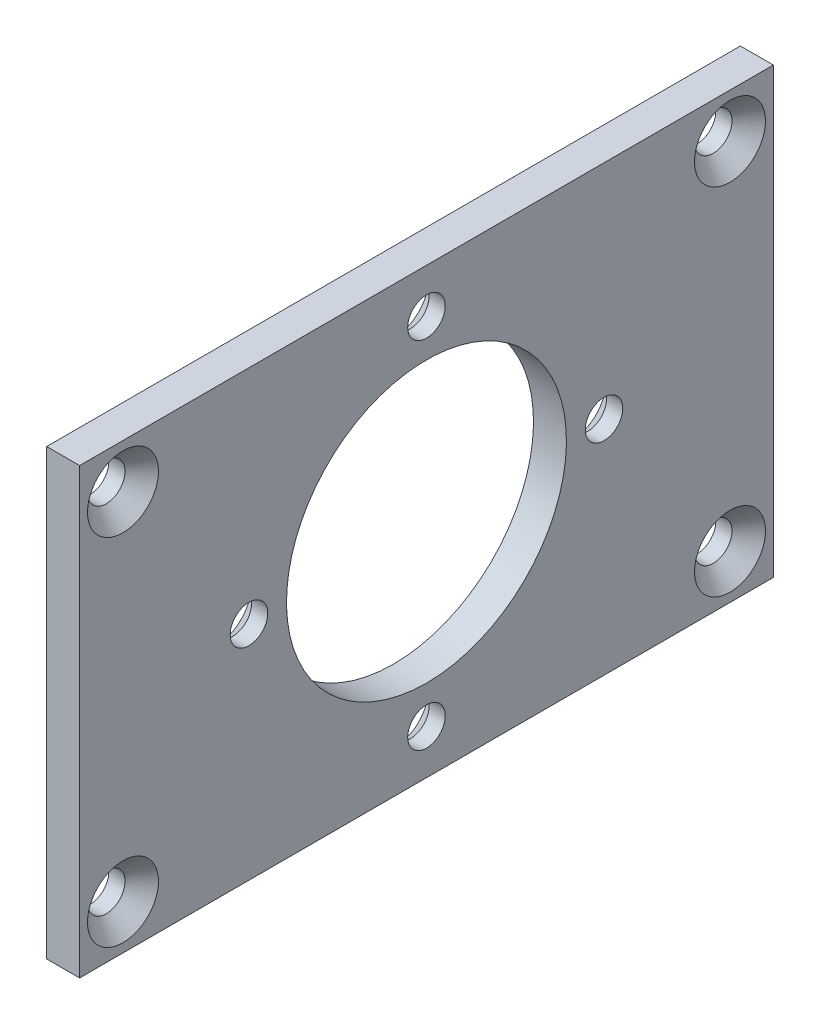
ISO-10303-21;
HEADER;
FILE_DESCRIPTION(('STEP AP214'),'2;1');
FILE_NAME('part.step','',(''),(''),'','','');
FILE_SCHEMA(('AUTOMOTIVE_DESIGN { 1 0 10303 214 1 1 1 1 }'));
ENDSEC;
DATA;
#1=APPLICATION_CONTEXT('core data for automotive mechanical design processes');
#2=APPLICATION_PROTOCOL_DEFINITION('international standard','automotive_design',2000,#1);
#3=PRODUCT_CONTEXT('',#1,'mechanical');
#4=PRODUCT('Part','Part','',(#3));
#5=PRODUCT_RELATED_PRODUCT_CATEGORY('part','',(#4));
#6=PRODUCT_DEFINITION_FORMATION('','',#4);
#7=PRODUCT_DEFINITION_CONTEXT('part definition',#1,'design');
#8=PRODUCT_DEFINITION('design','',#6,#7);
#9=PRODUCT_DEFINITION_SHAPE('','',#8);
#10=(LENGTH_UNIT() NAMED_UNIT(*) SI_UNIT(.MILLI.,.METRE.));
#11=(NAMED_UNIT(*) PLANE_ANGLE_UNIT() SI_UNIT($,.RADIAN.));
#12=(NAMED_UNIT(*) SI_UNIT($,.STERADIAN.) SOLID_ANGLE_UNIT());
#13=UNCERTAINTY_MEASURE_WITH_UNIT(LENGTH_MEASURE(1.E-05),#10,'distance_accuracy_value','');
#14=(GEOMETRIC_REPRESENTATION_CONTEXT(3) GLOBAL_UNCERTAINTY_ASSIGNED_CONTEXT((#13)) GLOBAL_UNIT_ASSIGNED_CONTEXT((#10,
#11,#12)) REPRESENTATION_CONTEXT('',''));
#15=CARTESIAN_POINT('',(0.,0.,0.));
#16=DIRECTION('',(0.,0.,1.));
#17=DIRECTION('',(1.,0.,0.));
#18=AXIS2_PLACEMENT_3D('',#15,#16,#17);
#19=CARTESIAN_POINT('',(0.,-8.14199792141975,-17.8977220287288));
#20=DIRECTION('',(1.,0.,0.));
#21=DIRECTION('',(0.,1.,0.));
#22=AXIS2_PLACEMENT_3D('',#19,#20,#21);
#23=PLANE('',#22);
#24=CARTESIAN_POINT('',(0.,-8.14199792141975,-17.8977220287288));
#25=DIRECTION('',(1.,0.,0.));
#26=DIRECTION('',(0.,1.,0.));
#27=AXIS2_PLACEMENT_3D('',#24,#25,#26);
#28=CIRCLE('',#27,20.5);
#29=CARTESIAN_POINT('',(0.,-28.6419979214198,-17.8977220287288));
#30=VERTEX_POINT('',#29);
#31=EDGE_CURVE('E169',#30,#30,#28,.T.);
#32=ORIENTED_EDGE('',*,*,#31,.T.);
#33=EDGE_LOOP('',(#32));
#34=FACE_BOUND('',#33,.T.);
#35=CARTESIAN_POINT('',(0.,17.8580020785802,-17.8977220287288));
#36=DIRECTION('',(1.,0.,0.));
#37=DIRECTION('',(0.,-1.,0.));
#38=AXIS2_PLACEMENT_3D('',#35,#36,#37);
#39=CIRCLE('',#38,5.2);
#40=CARTESIAN_POINT('',(0.,23.0580020785802,-17.8977220287288));
#41=VERTEX_POINT('',#40);
#42=EDGE_CURVE('E304',#41,#41,#39,.T.);
#43=ORIENTED_EDGE('',*,*,#42,.T.);
#44=EDGE_LOOP('',(#43));
#45=FACE_BOUND('',#44,.T.);
#46=CARTESIAN_POINT('',(0.,-8.14199792141975,-43.8977220287288));
#47=DIRECTION('',(1.,0.,0.));
#48=DIRECTION('',(0.,0.,1.));
#49=AXIS2_PLACEMENT_3D('',#46,#47,#48);
#50=CIRCLE('',#49,5.2);
#51=CARTESIAN_POINT('',(0.,-8.14199792141975,-49.0977220287288));
#52=VERTEX_POINT('',#51);
#53=EDGE_CURVE('E165',#52,#52,#50,.T.);
#54=ORIENTED_EDGE('',*,*,#53,.T.);
#55=EDGE_LOOP('',(#54));
#56=FACE_BOUND('',#55,.T.);
#57=CARTESIAN_POINT('',(0.,-34.1419979214198,-17.8977220287288));
#58=DIRECTION('',(1.,0.,0.));
#59=DIRECTION('',(0.,1.,0.));
#60=AXIS2_PLACEMENT_3D('',#57,#58,#59);
#61=CIRCLE('',#60,5.2);
#62=CARTESIAN_POINT('',(0.,-39.3419979214198,-17.8977220287288));
#63=VERTEX_POINT('',#62);
#64=EDGE_CURVE('E218',#63,#63,#61,.T.);
#65=ORIENTED_EDGE('',*,*,#64,.T.);
#66=EDGE_LOOP('',(#65));
#67=FACE_BOUND('',#66,.T.);
#68=CARTESIAN_POINT('',(0.,-8.14199792141976,8.10227797127123));
#69=DIRECTION('',(1.,0.,0.));
#70=DIRECTION('',(0.,0.,-1.));
#71=AXIS2_PLACEMENT_3D('',#68,#69,#70);
#72=CIRCLE('',#71,5.2);
#73=CARTESIAN_POINT('',(0.,-8.14199792141976,13.3022779712712));
#74=VERTEX_POINT('',#73);
#75=EDGE_CURVE('E189',#74,#74,#72,.T.);
#76=ORIENTED_EDGE('',*,*,#75,.T.);
#77=EDGE_LOOP('',(#76));
#78=FACE_BOUND('',#77,.T.);
#79=CARTESIAN_POINT('',(0.,17.8580020785802,26.5522779712712));
#80=DIRECTION('',(1.,0.,0.));
#81=DIRECTION('',(0.,1.,0.));
#82=AXIS2_PLACEMENT_3D('',#79,#80,#81);
#83=CIRCLE('',#82,2.75);
#84=CARTESIAN_POINT('',(0.,15.1080020785802,26.5522779712712));
#85=VERTEX_POINT('',#84);
#86=EDGE_CURVE('E179',#85,#85,#83,.T.);
#87=ORIENTED_EDGE('',*,*,#86,.T.);
#88=EDGE_LOOP('',(#87));
#89=FACE_BOUND('',#88,.T.);
#90=CARTESIAN_POINT('',(0.,17.8580020785802,-62.3477220287288));
#91=DIRECTION('',(1.,0.,0.));
#92=DIRECTION('',(0.,1.,0.));
#93=AXIS2_PLACEMENT_3D('',#90,#91,#92);
#94=CIRCLE('',#93,2.75);
#95=CARTESIAN_POINT('',(0.,15.1080020785802,-62.3477220287288));
#96=VERTEX_POINT('',#95);
#97=EDGE_CURVE('E204',#96,#96,#94,.T.);
#98=ORIENTED_EDGE('',*,*,#97,.T.);
#99=EDGE_LOOP('',(#98));
#100=FACE_BOUND('',#99,.T.);
#101=CARTESIAN_POINT('',(0.,-34.1419979214198,26.5522779712712));
#102=DIRECTION('',(1.,0.,0.));
#103=DIRECTION('',(0.,1.,0.));
#104=AXIS2_PLACEMENT_3D('',#101,#102,#103);
#105=CIRCLE('',#104,2.75);
#106=CARTESIAN_POINT('',(0.,-36.8919979214198,26.5522779712712));
#107=VERTEX_POINT('',#106);
#108=EDGE_CURVE('E185',#107,#107,#105,.T.);
#109=ORIENTED_EDGE('',*,*,#108,.T.);
#110=EDGE_LOOP('',(#109));
#111=FACE_BOUND('',#110,.T.);
#112=CARTESIAN_POINT('',(0.,-34.1419979214198,-62.3477220287288));
#113=DIRECTION('',(1.,0.,0.));
#114=DIRECTION('',(0.,1.,0.));
#115=AXIS2_PLACEMENT_3D('',#112,#113,#114);
#116=CIRCLE('',#115,2.75);
#117=CARTESIAN_POINT('',(0.,-36.8919979214198,-62.3477220287288));
#118=VERTEX_POINT('',#117);
#119=EDGE_CURVE('E274',#118,#118,#116,.T.);
#120=ORIENTED_EDGE('',*,*,#119,.T.);
#121=EDGE_LOOP('',(#120));
#122=FACE_BOUND('',#121,.T.);
#123=DIRECTION('',(0.,0.,1.));
#124=VECTOR('',#123,1.);
#125=CARTESIAN_POINT('',(0.,-40.6419979214198,-68.6977220287288));
#126=LINE('',#125,#124);
#127=CARTESIAN_POINT('',(0.,-40.6419979214198,-68.6977220287288));
#128=VERTEX_POINT('',#127);
#129=CARTESIAN_POINT('',(0.,-40.6419979214198,32.9022779712712));
#130=VERTEX_POINT('',#129);
#131=EDGE_CURVE('E26',#128,#130,#126,.T.);
#132=ORIENTED_EDGE('',*,*,#131,.T.);
#133=DIRECTION('',(0.,1.,0.));
#134=VECTOR('',#133,1.);
#135=CARTESIAN_POINT('',(0.,-40.6419979214198,32.9022779712712));
#136=LINE('',#135,#134);
#137=CARTESIAN_POINT('',(0.,24.3580020785802,32.9022779712712));
#138=VERTEX_POINT('',#137);
#139=EDGE_CURVE('E248',#130,#138,#136,.T.);
#140=ORIENTED_EDGE('',*,*,#139,.T.);
#141=DIRECTION('',(0.,0.,-1.));
#142=VECTOR('',#141,1.);
#143=CARTESIAN_POINT('',(0.,24.3580020785802,32.9022779712712));
#144=LINE('',#143,#142);
#145=CARTESIAN_POINT('',(0.,24.3580020785802,-68.6977220287288));
#146=VERTEX_POINT('',#145);
#147=EDGE_CURVE('E224',#138,#146,#144,.T.);
#148=ORIENTED_EDGE('',*,*,#147,.T.);
#149=DIRECTION('',(0.,-1.,0.));
#150=VECTOR('',#149,1.);
#151=CARTESIAN_POINT('',(0.,24.3580020785802,-68.6977220287288));
#152=LINE('',#151,#150);
#153=EDGE_CURVE('E235',#146,#128,#152,.T.);
#154=ORIENTED_EDGE('',*,*,#153,.T.);
#155=EDGE_LOOP('',(#132,#140,#148,#154));
#156=FACE_BOUND('',#155,.T.);
#157=ADVANCED_FACE('F16',(#34,#45,#56,#67,#78,#89,#100,#111,#122,#156),#23,.F.);
#158=CARTESIAN_POINT('',(4.826,-8.14199792141975,-17.8977220287288));
#159=DIRECTION('',(1.,0.,0.));
#160=DIRECTION('',(0.,1.,0.));
#161=AXIS2_PLACEMENT_3D('',#158,#159,#160);
#162=PLANE('',#161);
#163=CARTESIAN_POINT('',(4.826,-8.14199792141975,-17.8977220287288));
#164=DIRECTION('',(-1.,0.,0.));
#165=DIRECTION('',(0.,1.,0.));
#166=AXIS2_PLACEMENT_3D('',#163,#164,#165);
#167=CIRCLE('',#166,20.5);
#168=CARTESIAN_POINT('',(4.826,-28.6419979214198,-17.8977220287288));
#169=VERTEX_POINT('',#168);
#170=EDGE_CURVE('E173',#169,#169,#167,.T.);
#171=ORIENTED_EDGE('',*,*,#170,.T.);
#172=EDGE_LOOP('',(#171));
#173=FACE_BOUND('',#172,.T.);
#174=CARTESIAN_POINT('',(4.826,17.8580020785802,-17.8977220287288));
#175=DIRECTION('',(-1.,0.,0.));
#176=DIRECTION('',(0.,-1.,0.));
#177=AXIS2_PLACEMENT_3D('',#174,#175,#176);
#178=CIRCLE('',#177,2.75);
#179=CARTESIAN_POINT('',(4.826,20.6080020785802,-17.8977220287288));
#180=VERTEX_POINT('',#179);
#181=EDGE_CURVE('E171',#180,#180,#178,.T.);
#182=ORIENTED_EDGE('',*,*,#181,.T.);
#183=EDGE_LOOP('',(#182));
#184=FACE_BOUND('',#183,.T.);
#185=CARTESIAN_POINT('',(4.826,-8.14199792141975,-43.8977220287288));
#186=DIRECTION('',(-1.,0.,0.));
#187=DIRECTION('',(0.,0.,1.));
#188=AXIS2_PLACEMENT_3D('',#185,#186,#187);
#189=CIRCLE('',#188,2.75);
#190=CARTESIAN_POINT('',(4.826,-8.14199792141975,-46.6477220287288));
#191=VERTEX_POINT('',#190);
#192=EDGE_CURVE('E151',#191,#191,#189,.T.);
#193=ORIENTED_EDGE('',*,*,#192,.T.);
#194=EDGE_LOOP('',(#193));
#195=FACE_BOUND('',#194,.T.);
#196=CARTESIAN_POINT('',(4.826,-34.1419979214198,-17.8977220287288));
#197=DIRECTION('',(-1.,0.,0.));
#198=DIRECTION('',(0.,1.,0.));
#199=AXIS2_PLACEMENT_3D('',#196,#197,#198);
#200=CIRCLE('',#199,2.75);
#201=CARTESIAN_POINT('',(4.826,-36.8919979214198,-17.8977220287288));
#202=VERTEX_POINT('',#201);
#203=EDGE_CURVE('E231',#202,#202,#200,.T.);
#204=ORIENTED_EDGE('',*,*,#203,.T.);
#205=EDGE_LOOP('',(#204));
#206=FACE_BOUND('',#205,.T.);
#207=CARTESIAN_POINT('',(4.826,-8.14199792141976,8.10227797127123));
#208=DIRECTION('',(-1.,0.,0.));
#209=DIRECTION('',(0.,0.,-1.));
#210=AXIS2_PLACEMENT_3D('',#207,#208,#209);
#211=CIRCLE('',#210,2.75);
#212=CARTESIAN_POINT('',(4.826,-8.14199792141976,10.8522779712712));
#213=VERTEX_POINT('',#212);
#214=EDGE_CURVE('E256',#213,#213,#211,.T.);
#215=ORIENTED_EDGE('',*,*,#214,.T.);
#216=EDGE_LOOP('',(#215));
#217=FACE_BOUND('',#216,.T.);
#218=CARTESIAN_POINT('',(4.826,17.8580020785802,26.5522779712712));
#219=DIRECTION('',(-1.,0.,0.));
#220=DIRECTION('',(0.,1.,0.));
#221=AXIS2_PLACEMENT_3D('',#218,#219,#220);
#222=CIRCLE('',#221,5.2);
#223=CARTESIAN_POINT('',(4.826,12.6580020785802,26.5522779712712));
#224=VERTEX_POINT('',#223);
#225=EDGE_CURVE('E208',#224,#224,#222,.T.);
#226=ORIENTED_EDGE('',*,*,#225,.T.);
#227=EDGE_LOOP('',(#226));
#228=FACE_BOUND('',#227,.T.);
#229=CARTESIAN_POINT('',(4.826,17.8580020785802,-62.3477220287288));
#230=DIRECTION('',(-1.,0.,0.));
#231=DIRECTION('',(0.,1.,0.));
#232=AXIS2_PLACEMENT_3D('',#229,#230,#231);
#233=CIRCLE('',#232,5.2);
#234=CARTESIAN_POINT('',(4.826,12.6580020785802,-62.3477220287288));
#235=VERTEX_POINT('',#234);
#236=EDGE_CURVE('E227',#235,#235,#233,.T.);
#237=ORIENTED_EDGE('',*,*,#236,.T.);
#238=EDGE_LOOP('',(#237));
#239=FACE_BOUND('',#238,.T.);
#240=CARTESIAN_POINT('',(4.826,-34.1419979214198,26.5522779712712));
#241=DIRECTION('',(-1.,0.,0.));
#242=DIRECTION('',(0.,1.,0.));
#243=AXIS2_PLACEMENT_3D('',#240,#241,#242);
#244=CIRCLE('',#243,5.2);
#245=CARTESIAN_POINT('',(4.826,-39.3419979214198,26.5522779712712));
#246=VERTEX_POINT('',#245);
#247=EDGE_CURVE('E266',#246,#246,#244,.T.);
#248=ORIENTED_EDGE('',*,*,#247,.T.);
#249=EDGE_LOOP('',(#248));
#250=FACE_BOUND('',#249,.T.);
#251=CARTESIAN_POINT('',(4.826,-34.1419979214198,-62.3477220287288));
#252=DIRECTION('',(-1.,0.,0.));
#253=DIRECTION('',(0.,1.,0.));
#254=AXIS2_PLACEMENT_3D('',#251,#252,#253);
#255=CIRCLE('',#254,5.2);
#256=CARTESIAN_POINT('',(4.826,-39.3419979214198,-62.3477220287288));
#257=VERTEX_POINT('',#256);
#258=EDGE_CURVE('E294',#257,#257,#255,.T.);
#259=ORIENTED_EDGE('',*,*,#258,.T.);
#260=EDGE_LOOP('',(#259));
#261=FACE_BOUND('',#260,.T.);
#262=DIRECTION('',(0.,0.,-1.));
#263=VECTOR('',#262,1.);
#264=CARTESIAN_POINT('',(4.826,-40.6419979214198,-68.6977220287288));
#265=LINE('',#264,#263);
#266=CARTESIAN_POINT('',(4.826,-40.6419979214198,32.9022779712712));
#267=VERTEX_POINT('',#266);
#268=CARTESIAN_POINT('',(4.826,-40.6419979214198,-68.6977220287288));
#269=VERTEX_POINT('',#268);
#270=EDGE_CURVE('E11',#267,#269,#265,.T.);
#271=ORIENTED_EDGE('',*,*,#270,.T.);
#272=DIRECTION('',(0.,1.,0.));
#273=VECTOR('',#272,1.);
#274=CARTESIAN_POINT('',(4.826,24.3580020785802,-68.6977220287288));
#275=LINE('',#274,#273);
#276=CARTESIAN_POINT('',(4.826,24.3580020785802,-68.6977220287288));
#277=VERTEX_POINT('',#276);
#278=EDGE_CURVE('E239',#269,#277,#275,.T.);
#279=ORIENTED_EDGE('',*,*,#278,.T.);
#280=DIRECTION('',(0.,0.,1.));
#281=VECTOR('',#280,1.);
#282=CARTESIAN_POINT('',(4.826,24.3580020785802,32.9022779712712));
#283=LINE('',#282,#281);
#284=CARTESIAN_POINT('',(4.826,24.3580020785802,32.9022779712712));
#285=VERTEX_POINT('',#284);
#286=EDGE_CURVE('E219',#277,#285,#283,.T.);
#287=ORIENTED_EDGE('',*,*,#286,.T.);
#288=DIRECTION('',(0.,-1.,0.));
#289=VECTOR('',#288,1.);
#290=CARTESIAN_POINT('',(4.826,-40.6419979214198,32.9022779712712));
#291=LINE('',#290,#289);
#292=EDGE_CURVE('E247',#285,#267,#291,.T.);
#293=ORIENTED_EDGE('',*,*,#292,.T.);
#294=EDGE_LOOP('',(#271,#279,#287,#293));
#295=FACE_BOUND('',#294,.T.);
#296=ADVANCED_FACE('F334',(#173,#184,#195,#206,#217,#228,#239,#250,#261,#295),#162,.T.);
#297=CARTESIAN_POINT('',(0.,-40.6419979214198,32.9022779712712));
#298=DIRECTION('',(0.,-1.,0.));
#299=DIRECTION('',(0.,0.,-1.));
#300=AXIS2_PLACEMENT_3D('',#297,#298,#299);
#301=PLANE('',#300);
#302=ORIENTED_EDGE('',*,*,#131,.F.);
#303=DIRECTION('',(1.,0.,0.));
#304=VECTOR('',#303,1.);
#305=CARTESIAN_POINT('',(0.,-40.6419979214198,-68.6977220287288));
#306=LINE('',#305,#304);
#307=EDGE_CURVE('E19',#128,#269,#306,.T.);
#308=ORIENTED_EDGE('',*,*,#307,.T.);
#309=ORIENTED_EDGE('',*,*,#270,.F.);
#310=DIRECTION('',(1.,0.,0.));
#311=VECTOR('',#310,1.);
#312=CARTESIAN_POINT('',(0.,-40.6419979214198,32.9022779712712));
#313=LINE('',#312,#311);
#314=EDGE_CURVE('E243',#130,#267,#313,.T.);
#315=ORIENTED_EDGE('',*,*,#314,.F.);
#316=EDGE_LOOP('',(#302,#308,#309,#315));
#317=FACE_BOUND('',#316,.T.);
#318=ADVANCED_FACE('F337',(#317),#301,.T.);
#319=CARTESIAN_POINT('',(0.,-40.6419979214198,-68.6977220287288));
#320=DIRECTION('',(0.,0.,-1.));
#321=DIRECTION('',(0.,-1.,0.));
#322=AXIS2_PLACEMENT_3D('',#319,#320,#321);
#323=PLANE('',#322);
#324=ORIENTED_EDGE('',*,*,#153,.F.);
#325=DIRECTION('',(1.,0.,0.));
#326=VECTOR('',#325,1.);
#327=CARTESIAN_POINT('',(0.,24.3580020785802,-68.6977220287288));
#328=LINE('',#327,#326);
#329=EDGE_CURVE('E223',#146,#277,#328,.T.);
#330=ORIENTED_EDGE('',*,*,#329,.T.);
#331=ORIENTED_EDGE('',*,*,#278,.F.);
#332=ORIENTED_EDGE('',*,*,#307,.F.);
#333=EDGE_LOOP('',(#324,#330,#331,#332));
#334=FACE_BOUND('',#333,.T.);
#335=ADVANCED_FACE('F406',(#334),#323,.T.);
#336=CARTESIAN_POINT('',(0.,24.3580020785802,-68.6977220287288));
#337=DIRECTION('',(0.,1.,0.));
#338=DIRECTION('',(1.,0.,0.));
#339=AXIS2_PLACEMENT_3D('',#336,#337,#338);
#340=PLANE('',#339);
#341=ORIENTED_EDGE('',*,*,#147,.F.);
#342=DIRECTION('',(1.,0.,0.));
#343=VECTOR('',#342,1.);
#344=CARTESIAN_POINT('',(0.,24.3580020785802,32.9022779712712));
#345=LINE('',#344,#343);
#346=EDGE_CURVE('E318',#138,#285,#345,.T.);
#347=ORIENTED_EDGE('',*,*,#346,.T.);
#348=ORIENTED_EDGE('',*,*,#286,.F.);
#349=ORIENTED_EDGE('',*,*,#329,.F.);
#350=EDGE_LOOP('',(#341,#347,#348,#349));
#351=FACE_BOUND('',#350,.T.);
#352=ADVANCED_FACE('F402',(#351),#340,.T.);
#353=CARTESIAN_POINT('',(0.,24.3580020785802,32.9022779712712));
#354=DIRECTION('',(0.,0.,1.));
#355=DIRECTION('',(1.,0.,0.));
#356=AXIS2_PLACEMENT_3D('',#353,#354,#355);
#357=PLANE('',#356);
#358=ORIENTED_EDGE('',*,*,#139,.F.);
#359=ORIENTED_EDGE('',*,*,#314,.T.);
#360=ORIENTED_EDGE('',*,*,#292,.F.);
#361=ORIENTED_EDGE('',*,*,#346,.F.);
#362=EDGE_LOOP('',(#358,#359,#360,#361));
#363=FACE_BOUND('',#362,.T.);
#364=ADVANCED_FACE('F391',(#363),#357,.T.);
#365=CARTESIAN_POINT('',(2.1717,-8.14199792141975,-17.8977220287288));
#366=DIRECTION('',(-1.,0.,0.));
#367=DIRECTION('',(0.,1.,0.));
#368=AXIS2_PLACEMENT_3D('',#365,#366,#367);
#369=CYLINDRICAL_SURFACE('',#368,20.5);
#370=ORIENTED_EDGE('',*,*,#170,.F.);
#371=DIRECTION('',(-1.,0.,0.));
#372=VECTOR('',#371,1.);
#373=CARTESIAN_POINT('',(2.1717,-28.6419979214198,-17.8977220287288));
#374=LINE('',#373,#372);
#375=EDGE_CURVE('E194',#169,#30,#374,.T.);
#376=ORIENTED_EDGE('',*,*,#375,.T.);
#377=ORIENTED_EDGE('',*,*,#31,.F.);
#378=ORIENTED_EDGE('',*,*,#375,.F.);
#379=EDGE_LOOP('',(#370,#376,#377,#378));
#380=FACE_BOUND('',#379,.T.);
#381=ADVANCED_FACE('F466',(#380),#369,.F.);
#382=CARTESIAN_POINT('',(2.6543,17.8580020785802,-17.8977220287288));
#383=DIRECTION('',(1.,0.,0.));
#384=DIRECTION('',(0.,-1.,0.));
#385=AXIS2_PLACEMENT_3D('',#382,#383,#384);
#386=CYLINDRICAL_SURFACE('',#385,2.75);
#387=CARTESIAN_POINT('',(2.45,17.8580020785802,-17.8977220287288));
#388=DIRECTION('',(1.,0.,0.));
#389=DIRECTION('',(0.,-1.,0.));
#390=AXIS2_PLACEMENT_3D('',#387,#388,#389);
#391=CIRCLE('',#390,2.75);
#392=CARTESIAN_POINT('',(2.45,20.6080020785802,-17.8977220287288));
#393=VERTEX_POINT('',#392);
#394=EDGE_CURVE('E249',#393,#393,#391,.T.);
#395=ORIENTED_EDGE('',*,*,#394,.F.);
#396=DIRECTION('',(1.,0.,0.));
#397=VECTOR('',#396,1.);
#398=CARTESIAN_POINT('',(2.6543,20.6080020785802,-17.8977220287288));
#399=LINE('',#398,#397);
#400=EDGE_CURVE('E174',#393,#180,#399,.T.);
#401=ORIENTED_EDGE('',*,*,#400,.T.);
#402=ORIENTED_EDGE('',*,*,#181,.F.);
#403=ORIENTED_EDGE('',*,*,#400,.F.);
#404=EDGE_LOOP('',(#395,#401,#402,#403));
#405=FACE_BOUND('',#404,.T.);
#406=ADVANCED_FACE('F472',(#405),#386,.F.);
#407=CARTESIAN_POINT('',(1.225,17.8580020785802,-17.8977220287288));
#408=DIRECTION('',(-1.,0.,0.));
#409=DIRECTION('',(0.,-1.,0.));
#410=AXIS2_PLACEMENT_3D('',#407,#408,#409);
#411=CONICAL_SURFACE('',#410,3.975,0.785398163397448);
#412=ORIENTED_EDGE('',*,*,#42,.F.);
#413=DIRECTION('',(0.707106781186548,-0.707106781186548,0.));
#414=VECTOR('',#413,1.);
#415=CARTESIAN_POINT('',(1.225,21.8330020785802,-17.8977220287288));
#416=LINE('',#415,#414);
#417=EDGE_CURVE('E253',#41,#393,#416,.T.);
#418=ORIENTED_EDGE('',*,*,#417,.T.);
#419=ORIENTED_EDGE('',*,*,#394,.T.);
#420=ORIENTED_EDGE('',*,*,#417,.F.);
#421=EDGE_LOOP('',(#412,#418,#419,#420));
#422=FACE_BOUND('',#421,.T.);
#423=ADVANCED_FACE('F463',(#422),#411,.F.);
#424=CARTESIAN_POINT('',(2.6543,-8.14199792141975,-43.8977220287288));
#425=DIRECTION('',(1.,0.,0.));
#426=DIRECTION('',(0.,0.,1.));
#427=AXIS2_PLACEMENT_3D('',#424,#425,#426);
#428=CYLINDRICAL_SURFACE('',#427,2.75);
#429=CARTESIAN_POINT('',(2.45,-8.14199792141975,-43.8977220287288));
#430=DIRECTION('',(1.,0.,0.));
#431=DIRECTION('',(0.,0.,1.));
#432=AXIS2_PLACEMENT_3D('',#429,#430,#431);
#433=CIRCLE('',#432,2.75);
#434=CARTESIAN_POINT('',(2.45,-8.14199792141975,-46.6477220287288));
#435=VERTEX_POINT('',#434);
#436=EDGE_CURVE('E149',#435,#435,#433,.T.);
#437=ORIENTED_EDGE('',*,*,#436,.F.);
#438=DIRECTION('',(1.,0.,0.));
#439=VECTOR('',#438,1.);
#440=CARTESIAN_POINT('',(2.6543,-8.14199792141975,-46.6477220287288));
#441=LINE('',#440,#439);
#442=EDGE_CURVE('E146',#435,#191,#441,.T.);
#443=ORIENTED_EDGE('',*,*,#442,.T.);
#444=ORIENTED_EDGE('',*,*,#192,.F.);
#445=ORIENTED_EDGE('',*,*,#442,.F.);
#446=EDGE_LOOP('',(#437,#443,#444,#445));
#447=FACE_BOUND('',#446,.T.);
#448=ADVANCED_FACE('F148',(#447),#428,.F.);
#449=CARTESIAN_POINT('',(1.225,-8.14199792141975,-43.8977220287288));
#450=DIRECTION('',(-1.,0.,0.));
#451=DIRECTION('',(0.,0.,1.));
#452=AXIS2_PLACEMENT_3D('',#449,#450,#451);
#453=CONICAL_SURFACE('',#452,3.975,0.785398163397448);
#454=ORIENTED_EDGE('',*,*,#53,.F.);
#455=DIRECTION('',(0.707106781186548,0.,0.707106781186548));
#456=VECTOR('',#455,1.);
#457=CARTESIAN_POINT('',(1.225,-8.14199792141975,-47.8727220287288));
#458=LINE('',#457,#456);
#459=EDGE_CURVE('E157',#52,#435,#458,.T.);
#460=ORIENTED_EDGE('',*,*,#459,.T.);
#461=ORIENTED_EDGE('',*,*,#436,.T.);
#462=ORIENTED_EDGE('',*,*,#459,.F.);
#463=EDGE_LOOP('',(#454,#460,#461,#462));
#464=FACE_BOUND('',#463,.T.);
#465=ADVANCED_FACE('F156',(#464),#453,.F.);
#466=CARTESIAN_POINT('',(2.6543,-34.1419979214198,-17.8977220287288));
#467=DIRECTION('',(1.,0.,0.));
#468=DIRECTION('',(0.,1.,0.));
#469=AXIS2_PLACEMENT_3D('',#466,#467,#468);
#470=CYLINDRICAL_SURFACE('',#469,2.75);
#471=CARTESIAN_POINT('',(2.45,-34.1419979214198,-17.8977220287288));
#472=DIRECTION('',(1.,0.,0.));
#473=DIRECTION('',(0.,1.,0.));
#474=AXIS2_PLACEMENT_3D('',#471,#472,#473);
#475=CIRCLE('',#474,2.75);
#476=CARTESIAN_POINT('',(2.45,-36.8919979214198,-17.8977220287288));
#477=VERTEX_POINT('',#476);
#478=EDGE_CURVE('E217',#477,#477,#475,.T.);
#479=ORIENTED_EDGE('',*,*,#478,.F.);
#480=DIRECTION('',(1.,0.,0.));
#481=VECTOR('',#480,1.);
#482=CARTESIAN_POINT('',(2.6543,-36.8919979214198,-17.8977220287288));
#483=LINE('',#482,#481);
#484=EDGE_CURVE('E234',#477,#202,#483,.T.);
#485=ORIENTED_EDGE('',*,*,#484,.T.);
#486=ORIENTED_EDGE('',*,*,#203,.F.);
#487=ORIENTED_EDGE('',*,*,#484,.F.);
#488=EDGE_LOOP('',(#479,#485,#486,#487));
#489=FACE_BOUND('',#488,.T.);
#490=ADVANCED_FACE('F467',(#489),#470,.F.);
#491=CARTESIAN_POINT('',(1.225,-34.1419979214198,-17.8977220287288));
#492=DIRECTION('',(-1.,0.,0.));
#493=DIRECTION('',(0.,1.,0.));
#494=AXIS2_PLACEMENT_3D('',#491,#492,#493);
#495=CONICAL_SURFACE('',#494,3.975,0.785398163397448);
#496=ORIENTED_EDGE('',*,*,#64,.F.);
#497=DIRECTION('',(0.707106781186548,0.707106781186548,0.));
#498=VECTOR('',#497,1.);
#499=CARTESIAN_POINT('',(1.225,-38.1169979214198,-17.8977220287288));
#500=LINE('',#499,#498);
#501=EDGE_CURVE('E213',#63,#477,#500,.T.);
#502=ORIENTED_EDGE('',*,*,#501,.T.);
#503=ORIENTED_EDGE('',*,*,#478,.T.);
#504=ORIENTED_EDGE('',*,*,#501,.F.);
#505=EDGE_LOOP('',(#496,#502,#503,#504));
#506=FACE_BOUND('',#505,.T.);
#507=ADVANCED_FACE('F470',(#506),#495,.F.);
#508=CARTESIAN_POINT('',(2.6543,-8.14199792141976,8.10227797127123));
#509=DIRECTION('',(1.,0.,0.));
#510=DIRECTION('',(0.,0.,-1.));
#511=AXIS2_PLACEMENT_3D('',#508,#509,#510);
#512=CYLINDRICAL_SURFACE('',#511,2.75);
#513=CARTESIAN_POINT('',(2.45,-8.14199792141976,8.10227797127123));
#514=DIRECTION('',(1.,0.,0.));
#515=DIRECTION('',(0.,0.,-1.));
#516=AXIS2_PLACEMENT_3D('',#513,#514,#515);
#517=CIRCLE('',#516,2.75);
#518=CARTESIAN_POINT('',(2.45,-8.14199792141976,10.8522779712712));
#519=VERTEX_POINT('',#518);
#520=EDGE_CURVE('E311',#519,#519,#517,.T.);
#521=ORIENTED_EDGE('',*,*,#520,.F.);
#522=DIRECTION('',(1.,0.,0.));
#523=VECTOR('',#522,1.);
#524=CARTESIAN_POINT('',(2.6543,-8.14199792141976,10.8522779712712));
#525=LINE('',#524,#523);
#526=EDGE_CURVE('E308',#519,#213,#525,.T.);
#527=ORIENTED_EDGE('',*,*,#526,.T.);
#528=ORIENTED_EDGE('',*,*,#214,.F.);
#529=ORIENTED_EDGE('',*,*,#526,.F.);
#530=EDGE_LOOP('',(#521,#527,#528,#529));
#531=FACE_BOUND('',#530,.T.);
#532=ADVANCED_FACE('F459',(#531),#512,.F.);
#533=CARTESIAN_POINT('',(1.225,-8.14199792141976,8.10227797127123));
#534=DIRECTION('',(-1.,0.,0.));
#535=DIRECTION('',(0.,0.,-1.));
#536=AXIS2_PLACEMENT_3D('',#533,#534,#535);
#537=CONICAL_SURFACE('',#536,3.975,0.785398163397448);
#538=ORIENTED_EDGE('',*,*,#75,.F.);
#539=DIRECTION('',(0.707106781186548,0.,-0.707106781186548));
#540=VECTOR('',#539,1.);
#541=CARTESIAN_POINT('',(1.225,-8.14199792141976,12.0772779712712));
#542=LINE('',#541,#540);
#543=EDGE_CURVE('E192',#74,#519,#542,.T.);
#544=ORIENTED_EDGE('',*,*,#543,.T.);
#545=ORIENTED_EDGE('',*,*,#520,.T.);
#546=ORIENTED_EDGE('',*,*,#543,.F.);
#547=EDGE_LOOP('',(#538,#544,#545,#546));
#548=FACE_BOUND('',#547,.T.);
#549=ADVANCED_FACE('F455',(#548),#537,.F.);
#550=CARTESIAN_POINT('',(-4.174,17.8580020785802,26.5522779712712));
#551=DIRECTION('',(-1.,0.,0.));
#552=DIRECTION('',(0.,1.,0.));
#553=AXIS2_PLACEMENT_3D('',#550,#551,#552);
#554=CYLINDRICAL_SURFACE('',#553,2.75);
#555=CARTESIAN_POINT('',(2.376,17.8580020785802,26.5522779712712));
#556=DIRECTION('',(-1.,0.,0.));
#557=DIRECTION('',(0.,1.,0.));
#558=AXIS2_PLACEMENT_3D('',#555,#556,#557);
#559=CIRCLE('',#558,2.75);
#560=CARTESIAN_POINT('',(2.376,15.1080020785802,26.5522779712712));
#561=VERTEX_POINT('',#560);
#562=EDGE_CURVE('E180',#561,#561,#559,.T.);
#563=ORIENTED_EDGE('',*,*,#562,.F.);
#564=DIRECTION('',(-1.,0.,0.));
#565=VECTOR('',#564,1.);
#566=CARTESIAN_POINT('',(-4.174,15.1080020785802,26.5522779712712));
#567=LINE('',#566,#565);
#568=EDGE_CURVE('E175',#561,#85,#567,.T.);
#569=ORIENTED_EDGE('',*,*,#568,.T.);
#570=ORIENTED_EDGE('',*,*,#86,.F.);
#571=ORIENTED_EDGE('',*,*,#568,.F.);
#572=EDGE_LOOP('',(#563,#569,#570,#571));
#573=FACE_BOUND('',#572,.T.);
#574=ADVANCED_FACE('F458',(#573),#554,.F.);
#575=CARTESIAN_POINT('',(3.601,17.8580020785802,26.5522779712712));
#576=DIRECTION('',(1.,0.,0.));
#577=DIRECTION('',(0.,1.,0.));
#578=AXIS2_PLACEMENT_3D('',#575,#576,#577);
#579=CONICAL_SURFACE('',#578,3.975,0.785398163397448);
#580=ORIENTED_EDGE('',*,*,#225,.F.);
#581=DIRECTION('',(-0.707106781186548,0.707106781186548,0.));
#582=VECTOR('',#581,1.);
#583=CARTESIAN_POINT('',(3.601,13.8830020785802,26.5522779712712));
#584=LINE('',#583,#582);
#585=EDGE_CURVE('E201',#224,#561,#584,.T.);
#586=ORIENTED_EDGE('',*,*,#585,.T.);
#587=ORIENTED_EDGE('',*,*,#562,.T.);
#588=ORIENTED_EDGE('',*,*,#585,.F.);
#589=EDGE_LOOP('',(#580,#586,#587,#588));
#590=FACE_BOUND('',#589,.T.);
#591=ADVANCED_FACE('F449',(#590),#579,.F.);
#592=CARTESIAN_POINT('',(-4.174,17.8580020785802,-62.3477220287288));
#593=DIRECTION('',(-1.,0.,0.));
#594=DIRECTION('',(0.,1.,0.));
#595=AXIS2_PLACEMENT_3D('',#592,#593,#594);
#596=CYLINDRICAL_SURFACE('',#595,2.75);
#597=CARTESIAN_POINT('',(2.376,17.8580020785802,-62.3477220287288));
#598=DIRECTION('',(-1.,0.,0.));
#599=DIRECTION('',(0.,1.,0.));
#600=AXIS2_PLACEMENT_3D('',#597,#598,#599);
#601=CIRCLE('',#600,2.75);
#602=CARTESIAN_POINT('',(2.376,15.1080020785802,-62.3477220287288));
#603=VERTEX_POINT('',#602);
#604=EDGE_CURVE('E282',#603,#603,#601,.T.);
#605=ORIENTED_EDGE('',*,*,#604,.F.);
#606=DIRECTION('',(-1.,0.,0.));
#607=VECTOR('',#606,1.);
#608=CARTESIAN_POINT('',(-4.174,15.1080020785802,-62.3477220287288));
#609=LINE('',#608,#607);
#610=EDGE_CURVE('E209',#603,#96,#609,.T.);
#611=ORIENTED_EDGE('',*,*,#610,.T.);
#612=ORIENTED_EDGE('',*,*,#97,.F.);
#613=ORIENTED_EDGE('',*,*,#610,.F.);
#614=EDGE_LOOP('',(#605,#611,#612,#613));
#615=FACE_BOUND('',#614,.T.);
#616=ADVANCED_FACE('F435',(#615),#596,.F.);
#617=CARTESIAN_POINT('',(3.601,17.8580020785802,-62.3477220287288));
#618=DIRECTION('',(1.,0.,0.));
#619=DIRECTION('',(0.,1.,0.));
#620=AXIS2_PLACEMENT_3D('',#617,#618,#619);
#621=CONICAL_SURFACE('',#620,3.975,0.785398163397448);
#622=ORIENTED_EDGE('',*,*,#236,.F.);
#623=DIRECTION('',(-0.707106781186548,0.707106781186548,0.));
#624=VECTOR('',#623,1.);
#625=CARTESIAN_POINT('',(3.601,13.8830020785802,-62.3477220287288));
#626=LINE('',#625,#624);
#627=EDGE_CURVE('E364',#235,#603,#626,.T.);
#628=ORIENTED_EDGE('',*,*,#627,.T.);
#629=ORIENTED_EDGE('',*,*,#604,.T.);
#630=ORIENTED_EDGE('',*,*,#627,.F.);
#631=EDGE_LOOP('',(#622,#628,#629,#630));
#632=FACE_BOUND('',#631,.T.);
#633=ADVANCED_FACE('F437',(#632),#621,.F.);
#634=CARTESIAN_POINT('',(-4.174,-34.1419979214198,26.5522779712712));
#635=DIRECTION('',(-1.,0.,0.));
#636=DIRECTION('',(0.,1.,0.));
#637=AXIS2_PLACEMENT_3D('',#634,#635,#636);
#638=CYLINDRICAL_SURFACE('',#637,2.75);
#639=CARTESIAN_POINT('',(2.376,-34.1419979214198,26.5522779712712));
#640=DIRECTION('',(-1.,0.,0.));
#641=DIRECTION('',(0.,1.,0.));
#642=AXIS2_PLACEMENT_3D('',#639,#640,#641);
#643=CIRCLE('',#642,2.75);
#644=CARTESIAN_POINT('',(2.376,-36.8919979214198,26.5522779712712));
#645=VERTEX_POINT('',#644);
#646=EDGE_CURVE('E186',#645,#645,#643,.T.);
#647=ORIENTED_EDGE('',*,*,#646,.F.);
#648=DIRECTION('',(-1.,0.,0.));
#649=VECTOR('',#648,1.);
#650=CARTESIAN_POINT('',(-4.174,-36.8919979214198,26.5522779712712));
#651=LINE('',#650,#649);
#652=EDGE_CURVE('E181',#645,#107,#651,.T.);
#653=ORIENTED_EDGE('',*,*,#652,.T.);
#654=ORIENTED_EDGE('',*,*,#108,.F.);
#655=ORIENTED_EDGE('',*,*,#652,.F.);
#656=EDGE_LOOP('',(#647,#653,#654,#655));
#657=FACE_BOUND('',#656,.T.);
#658=ADVANCED_FACE('F439',(#657),#638,.F.);
#659=CARTESIAN_POINT('',(3.601,-34.1419979214198,26.5522779712712));
#660=DIRECTION('',(1.,0.,0.));
#661=DIRECTION('',(0.,1.,0.));
#662=AXIS2_PLACEMENT_3D('',#659,#660,#661);
#663=CONICAL_SURFACE('',#662,3.975,0.785398163397448);
#664=ORIENTED_EDGE('',*,*,#247,.F.);
#665=DIRECTION('',(-0.707106781186548,0.707106781186548,0.));
#666=VECTOR('',#665,1.);
#667=CARTESIAN_POINT('',(3.601,-38.1169979214198,26.5522779712712));
#668=LINE('',#667,#666);
#669=EDGE_CURVE('E259',#246,#645,#668,.T.);
#670=ORIENTED_EDGE('',*,*,#669,.T.);
#671=ORIENTED_EDGE('',*,*,#646,.T.);
#672=ORIENTED_EDGE('',*,*,#669,.F.);
#673=EDGE_LOOP('',(#664,#670,#671,#672));
#674=FACE_BOUND('',#673,.T.);
#675=ADVANCED_FACE('F446',(#674),#663,.F.);
#676=CARTESIAN_POINT('',(-4.174,-34.1419979214198,-62.3477220287288));
#677=DIRECTION('',(-1.,0.,0.));
#678=DIRECTION('',(0.,1.,0.));
#679=AXIS2_PLACEMENT_3D('',#676,#677,#678);
#680=CYLINDRICAL_SURFACE('',#679,2.75);
#681=CARTESIAN_POINT('',(2.376,-34.1419979214198,-62.3477220287288));
#682=DIRECTION('',(-1.,0.,0.));
#683=DIRECTION('',(0.,1.,0.));
#684=AXIS2_PLACEMENT_3D('',#681,#682,#683);
#685=CIRCLE('',#684,2.75);
#686=CARTESIAN_POINT('',(2.376,-36.8919979214198,-62.3477220287288));
#687=VERTEX_POINT('',#686);
#688=EDGE_CURVE('E322',#687,#687,#685,.T.);
#689=ORIENTED_EDGE('',*,*,#688,.F.);
#690=DIRECTION('',(-1.,0.,0.));
#691=VECTOR('',#690,1.);
#692=CARTESIAN_POINT('',(-4.174,-36.8919979214198,-62.3477220287288));
#693=LINE('',#692,#691);
#694=EDGE_CURVE('E278',#687,#118,#693,.T.);
#695=ORIENTED_EDGE('',*,*,#694,.T.);
#696=ORIENTED_EDGE('',*,*,#119,.F.);
#697=ORIENTED_EDGE('',*,*,#694,.F.);
#698=EDGE_LOOP('',(#689,#695,#696,#697));
#699=FACE_BOUND('',#698,.T.);
#700=ADVANCED_FACE('F376',(#699),#680,.F.);
#701=CARTESIAN_POINT('',(3.601,-34.1419979214198,-62.3477220287288));
#702=DIRECTION('',(1.,0.,0.));
#703=DIRECTION('',(0.,1.,0.));
#704=AXIS2_PLACEMENT_3D('',#701,#702,#703);
#705=CONICAL_SURFACE('',#704,3.975,0.785398163397448);
#706=ORIENTED_EDGE('',*,*,#258,.F.);
#707=DIRECTION('',(-0.707106781186548,0.707106781186548,0.));
#708=VECTOR('',#707,1.);
#709=CARTESIAN_POINT('',(3.601,-38.1169979214198,-62.3477220287288));
#710=LINE('',#709,#708);
#711=EDGE_CURVE('E298',#257,#687,#710,.T.);
#712=ORIENTED_EDGE('',*,*,#711,.T.);
#713=ORIENTED_EDGE('',*,*,#688,.T.);
#714=ORIENTED_EDGE('',*,*,#711,.F.);
#715=EDGE_LOOP('',(#706,#712,#713,#714));
#716=FACE_BOUND('',#715,.T.);
#717=ADVANCED_FACE('F353',(#716),#705,.F.);
#718=CLOSED_SHELL('',(#157,#296,#318,#335,#352,#364,#381,#406,#423,#448,#465,#490,#507,#532,
#549,#574,#591,#616,#633,#658,#675,#700,#717));
#719=MANIFOLD_SOLID_BREP('B1',#718);
#720=ADVANCED_BREP_SHAPE_REPRESENTATION('',(#18,#719),#14);
#721=SHAPE_DEFINITION_REPRESENTATION(#9,#720);
ENDSEC;
END-ISO-10303-21;
